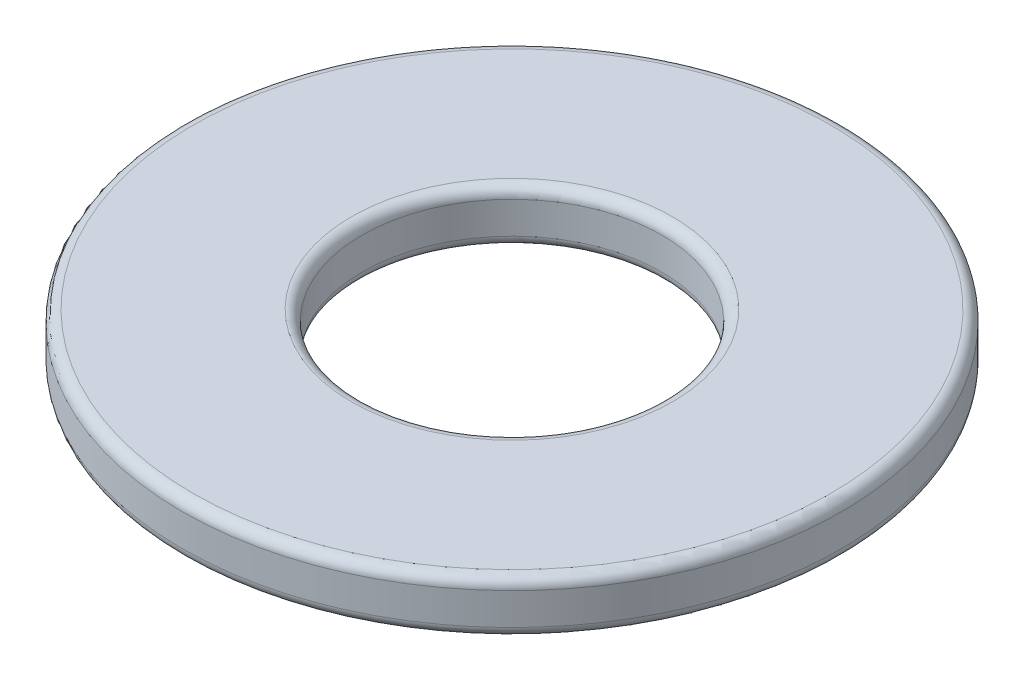
ISO-10303-21;
HEADER;
FILE_DESCRIPTION(('STEP AP214'),'2;1');
FILE_NAME('part.step','',(''),(''),'','','');
FILE_SCHEMA(('AUTOMOTIVE_DESIGN { 1 0 10303 214 1 1 1 1 }'));
ENDSEC;
DATA;
#1=APPLICATION_CONTEXT('core data for automotive mechanical design processes');
#2=APPLICATION_PROTOCOL_DEFINITION('international standard','automotive_design',2000,#1);
#3=PRODUCT_CONTEXT('',#1,'mechanical');
#4=PRODUCT('Part','Part','',(#3));
#5=PRODUCT_RELATED_PRODUCT_CATEGORY('part','',(#4));
#6=PRODUCT_DEFINITION_FORMATION('','',#4);
#7=PRODUCT_DEFINITION_CONTEXT('part definition',#1,'design');
#8=PRODUCT_DEFINITION('design','',#6,#7);
#9=PRODUCT_DEFINITION_SHAPE('','',#8);
#10=(LENGTH_UNIT() NAMED_UNIT(*) SI_UNIT(.MILLI.,.METRE.));
#11=(NAMED_UNIT(*) PLANE_ANGLE_UNIT() SI_UNIT($,.RADIAN.));
#12=(NAMED_UNIT(*) SI_UNIT($,.STERADIAN.) SOLID_ANGLE_UNIT());
#13=UNCERTAINTY_MEASURE_WITH_UNIT(LENGTH_MEASURE(1.E-05),#10,'distance_accuracy_value','');
#14=(GEOMETRIC_REPRESENTATION_CONTEXT(3) GLOBAL_UNCERTAINTY_ASSIGNED_CONTEXT((#13)) GLOBAL_UNIT_ASSIGNED_CONTEXT((#10,
#11,#12)) REPRESENTATION_CONTEXT('',''));
#15=CARTESIAN_POINT('',(0.,0.,0.));
#16=DIRECTION('',(0.,0.,1.));
#17=DIRECTION('',(1.,0.,0.));
#18=AXIS2_PLACEMENT_3D('',#15,#16,#17);
#19=CARTESIAN_POINT('',(0.,1.016,0.));
#20=DIRECTION('',(0.,1.,0.));
#21=DIRECTION('',(0.,0.,1.));
#22=AXIS2_PLACEMENT_3D('',#19,#20,#21);
#23=PLANE('',#22);
#24=CARTESIAN_POINT('',(0.,1.016,0.));
#25=DIRECTION('',(0.,1.,0.));
#26=DIRECTION('',(0.,0.,1.));
#27=AXIS2_PLACEMENT_3D('',#24,#25,#26);
#28=CIRCLE('',#27,3.0607);
#29=CARTESIAN_POINT('',(0.,1.016,3.0607));
#30=VERTEX_POINT('',#29);
#31=EDGE_CURVE('E48',#30,#30,#28,.F.);
#32=ORIENTED_EDGE('',*,*,#31,.T.);
#33=EDGE_LOOP('',(#32));
#34=FACE_BOUND('',#33,.T.);
#35=CARTESIAN_POINT('',(0.,1.016,0.));
#36=DIRECTION('',(0.,1.,0.));
#37=DIRECTION('',(0.,0.,1.));
#38=AXIS2_PLACEMENT_3D('',#35,#36,#37);
#39=CIRCLE('',#38,6.0833);
#40=CARTESIAN_POINT('',(0.,1.016,6.0833));
#41=VERTEX_POINT('',#40);
#42=EDGE_CURVE('E51',#41,#41,#39,.T.);
#43=ORIENTED_EDGE('',*,*,#42,.T.);
#44=EDGE_LOOP('',(#43));
#45=FACE_BOUND('',#44,.T.);
#46=ADVANCED_FACE('F28',(#34,#45),#23,.T.);
#47=CARTESIAN_POINT('',(0.,0.,0.));
#48=DIRECTION('',(0.,1.,0.));
#49=DIRECTION('',(0.,0.,1.));
#50=AXIS2_PLACEMENT_3D('',#47,#48,#49);
#51=PLANE('',#50);
#52=CARTESIAN_POINT('',(0.,0.,0.));
#53=DIRECTION('',(0.,1.,0.));
#54=DIRECTION('',(0.,0.,1.));
#55=AXIS2_PLACEMENT_3D('',#52,#53,#54);
#56=CIRCLE('',#55,3.0607);
#57=CARTESIAN_POINT('',(0.,0.,3.0607));
#58=VERTEX_POINT('',#57);
#59=EDGE_CURVE('E10',#58,#58,#56,.T.);
#60=ORIENTED_EDGE('',*,*,#59,.T.);
#61=EDGE_LOOP('',(#60));
#62=FACE_BOUND('',#61,.T.);
#63=CARTESIAN_POINT('',(0.,0.,0.));
#64=DIRECTION('',(0.,1.,0.));
#65=DIRECTION('',(0.,0.,1.));
#66=AXIS2_PLACEMENT_3D('',#63,#64,#65);
#67=CIRCLE('',#66,6.0833);
#68=CARTESIAN_POINT('',(0.,0.,6.0833));
#69=VERTEX_POINT('',#68);
#70=EDGE_CURVE('E35',#69,#69,#67,.F.);
#71=ORIENTED_EDGE('',*,*,#70,.T.);
#72=EDGE_LOOP('',(#71));
#73=FACE_BOUND('',#72,.T.);
#74=ADVANCED_FACE('F79',(#62,#73),#51,.F.);
#75=CARTESIAN_POINT('',(0.,1.016,0.));
#76=DIRECTION('',(0.,-1.,0.));
#77=DIRECTION('',(0.,0.,-1.));
#78=AXIS2_PLACEMENT_3D('',#75,#76,#77);
#79=CYLINDRICAL_SURFACE('',#78,6.2865);
#80=CARTESIAN_POINT('',(0.,0.8128,0.));
#81=DIRECTION('',(0.,1.,0.));
#82=DIRECTION('',(0.,0.,1.));
#83=AXIS2_PLACEMENT_3D('',#80,#81,#82);
#84=CIRCLE('',#83,6.2865);
#85=CARTESIAN_POINT('',(0.,0.8128,6.2865));
#86=VERTEX_POINT('',#85);
#87=EDGE_CURVE('E39',#86,#86,#84,.F.);
#88=ORIENTED_EDGE('',*,*,#87,.T.);
#89=EDGE_LOOP('',(#88));
#90=FACE_BOUND('',#89,.T.);
#91=CARTESIAN_POINT('',(0.,0.2032,0.));
#92=DIRECTION('',(0.,1.,0.));
#93=DIRECTION('',(0.,0.,1.));
#94=AXIS2_PLACEMENT_3D('',#91,#92,#93);
#95=CIRCLE('',#94,6.2865);
#96=CARTESIAN_POINT('',(0.,0.2032,6.2865));
#97=VERTEX_POINT('',#96);
#98=EDGE_CURVE('E43',#97,#97,#95,.T.);
#99=ORIENTED_EDGE('',*,*,#98,.T.);
#100=EDGE_LOOP('',(#99));
#101=FACE_BOUND('',#100,.T.);
#102=ADVANCED_FACE('F30',(#90,#101),#79,.T.);
#103=CARTESIAN_POINT('',(0.,1.016,0.));
#104=DIRECTION('',(0.,-1.,0.));
#105=DIRECTION('',(0.,0.,-1.));
#106=AXIS2_PLACEMENT_3D('',#103,#104,#105);
#107=CYLINDRICAL_SURFACE('',#106,2.8575);
#108=CARTESIAN_POINT('',(0.,0.8128,0.));
#109=DIRECTION('',(0.,1.,0.));
#110=DIRECTION('',(0.,0.,1.));
#111=AXIS2_PLACEMENT_3D('',#108,#109,#110);
#112=CIRCLE('',#111,2.8575);
#113=CARTESIAN_POINT('',(0.,0.8128,2.8575));
#114=VERTEX_POINT('',#113);
#115=EDGE_CURVE('E54',#114,#114,#112,.T.);
#116=ORIENTED_EDGE('',*,*,#115,.T.);
#117=EDGE_LOOP('',(#116));
#118=FACE_BOUND('',#117,.T.);
#119=CARTESIAN_POINT('',(0.,0.2032,0.));
#120=DIRECTION('',(0.,1.,0.));
#121=DIRECTION('',(0.,0.,1.));
#122=AXIS2_PLACEMENT_3D('',#119,#120,#121);
#123=CIRCLE('',#122,2.8575);
#124=CARTESIAN_POINT('',(0.,0.2032,2.8575));
#125=VERTEX_POINT('',#124);
#126=EDGE_CURVE('E57',#125,#125,#123,.F.);
#127=ORIENTED_EDGE('',*,*,#126,.T.);
#128=EDGE_LOOP('',(#127));
#129=FACE_BOUND('',#128,.T.);
#130=ADVANCED_FACE('F61',(#118,#129),#107,.F.);
#131=CARTESIAN_POINT('',(0.,0.8128,0.));
#132=DIRECTION('',(0.,1.,0.));
#133=DIRECTION('',(0.,0.,1.));
#134=AXIS2_PLACEMENT_3D('',#131,#132,#133);
#135=TOROIDAL_SURFACE('',#134,3.0607,0.2032);
#136=ORIENTED_EDGE('',*,*,#31,.F.);
#137=EDGE_LOOP('',(#136));
#138=FACE_BOUND('',#137,.T.);
#139=ORIENTED_EDGE('',*,*,#115,.F.);
#140=EDGE_LOOP('',(#139));
#141=FACE_BOUND('',#140,.T.);
#142=ADVANCED_FACE('F75',(#138,#141),#135,.T.);
#143=CARTESIAN_POINT('',(0.,0.8128,0.));
#144=DIRECTION('',(0.,1.,0.));
#145=DIRECTION('',(0.,0.,1.));
#146=AXIS2_PLACEMENT_3D('',#143,#144,#145);
#147=TOROIDAL_SURFACE('',#146,6.0833,0.2032);
#148=ORIENTED_EDGE('',*,*,#87,.F.);
#149=EDGE_LOOP('',(#148));
#150=FACE_BOUND('',#149,.T.);
#151=ORIENTED_EDGE('',*,*,#42,.F.);
#152=EDGE_LOOP('',(#151));
#153=FACE_BOUND('',#152,.T.);
#154=ADVANCED_FACE('F67',(#150,#153),#147,.T.);
#155=CARTESIAN_POINT('',(0.,0.2032,0.));
#156=DIRECTION('',(0.,1.,0.));
#157=DIRECTION('',(0.,0.,1.));
#158=AXIS2_PLACEMENT_3D('',#155,#156,#157);
#159=TOROIDAL_SURFACE('',#158,3.0607,0.2032);
#160=ORIENTED_EDGE('',*,*,#126,.F.);
#161=EDGE_LOOP('',(#160));
#162=FACE_BOUND('',#161,.T.);
#163=ORIENTED_EDGE('',*,*,#59,.F.);
#164=EDGE_LOOP('',(#163));
#165=FACE_BOUND('',#164,.T.);
#166=ADVANCED_FACE('F63',(#162,#165),#159,.T.);
#167=CARTESIAN_POINT('',(0.,0.2032,0.));
#168=DIRECTION('',(0.,1.,0.));
#169=DIRECTION('',(0.,0.,1.));
#170=AXIS2_PLACEMENT_3D('',#167,#168,#169);
#171=TOROIDAL_SURFACE('',#170,6.0833,0.2032);
#172=ORIENTED_EDGE('',*,*,#70,.F.);
#173=EDGE_LOOP('',(#172));
#174=FACE_BOUND('',#173,.T.);
#175=ORIENTED_EDGE('',*,*,#98,.F.);
#176=EDGE_LOOP('',(#175));
#177=FACE_BOUND('',#176,.T.);
#178=ADVANCED_FACE('F66',(#174,#177),#171,.T.);
#179=CLOSED_SHELL('',(#46,#74,#102,#130,#142,#154,#166,#178));
#180=MANIFOLD_SOLID_BREP('B2',#179);
#181=ADVANCED_BREP_SHAPE_REPRESENTATION('',(#18,#180),#14);
#182=SHAPE_DEFINITION_REPRESENTATION(#9,#181);
ENDSEC;
END-ISO-10303-21;
